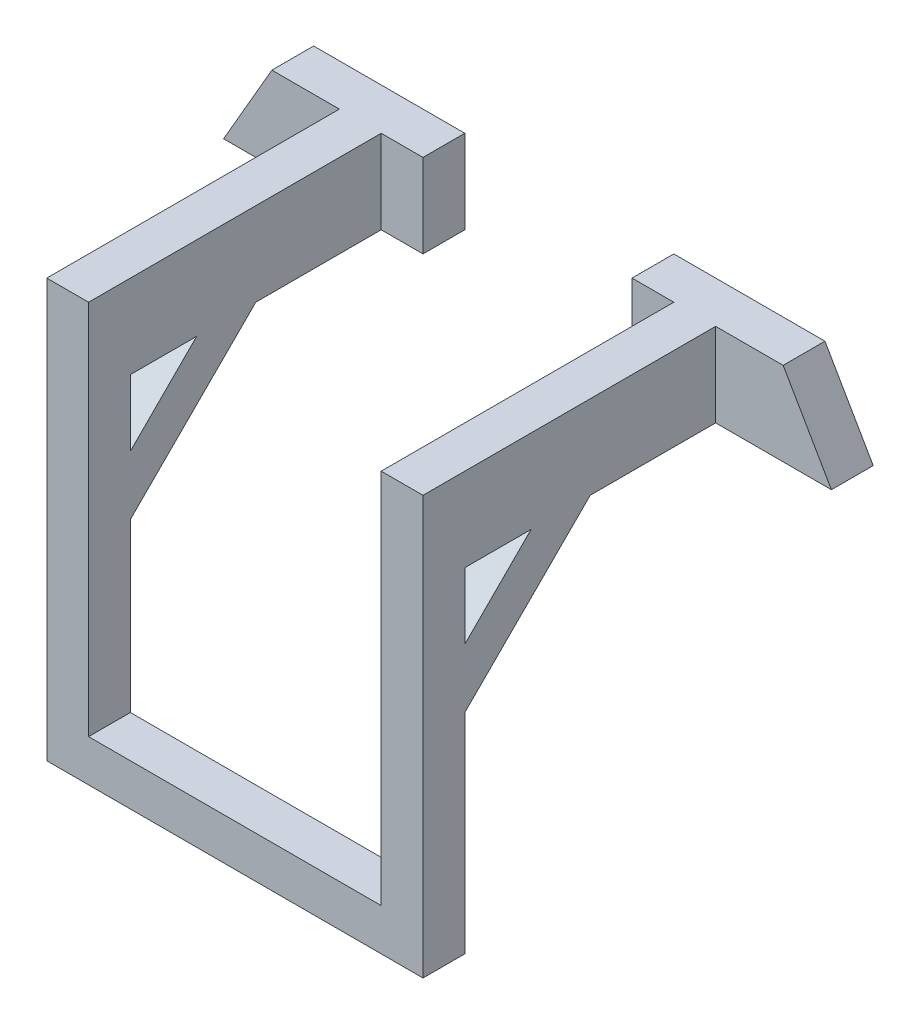
ISO-10303-21;
HEADER;
FILE_DESCRIPTION(('STEP AP214'),'2;1');
FILE_NAME('part.step','',(''),(''),'','','');
FILE_SCHEMA(('AUTOMOTIVE_DESIGN { 1 0 10303 214 1 1 1 1 }'));
ENDSEC;
DATA;
#1=APPLICATION_CONTEXT('core data for automotive mechanical design processes');
#2=APPLICATION_PROTOCOL_DEFINITION('international standard','automotive_design',2000,#1);
#3=PRODUCT_CONTEXT('',#1,'mechanical');
#4=PRODUCT('Part','Part','',(#3));
#5=PRODUCT_RELATED_PRODUCT_CATEGORY('part','',(#4));
#6=PRODUCT_DEFINITION_FORMATION('','',#4);
#7=PRODUCT_DEFINITION_CONTEXT('part definition',#1,'design');
#8=PRODUCT_DEFINITION('design','',#6,#7);
#9=PRODUCT_DEFINITION_SHAPE('','',#8);
#10=(LENGTH_UNIT() NAMED_UNIT(*) SI_UNIT(.MILLI.,.METRE.));
#11=(NAMED_UNIT(*) PLANE_ANGLE_UNIT() SI_UNIT($,.RADIAN.));
#12=(NAMED_UNIT(*) SI_UNIT($,.STERADIAN.) SOLID_ANGLE_UNIT());
#13=UNCERTAINTY_MEASURE_WITH_UNIT(LENGTH_MEASURE(1.E-05),#10,'distance_accuracy_value','');
#14=(GEOMETRIC_REPRESENTATION_CONTEXT(3) GLOBAL_UNCERTAINTY_ASSIGNED_CONTEXT((#13)) GLOBAL_UNIT_ASSIGNED_CONTEXT((#10,
#11,#12)) REPRESENTATION_CONTEXT('',''));
#15=CARTESIAN_POINT('',(0.,0.,0.));
#16=DIRECTION('',(0.,0.,1.));
#17=DIRECTION('',(1.,0.,0.));
#18=AXIS2_PLACEMENT_3D('',#15,#16,#17);
#19=CARTESIAN_POINT('',(225.,50.,0.));
#20=DIRECTION('',(0.,1.,0.));
#21=DIRECTION('',(1.,0.,0.));
#22=AXIS2_PLACEMENT_3D('',#19,#20,#21);
#23=PLANE('',#22);
#24=DIRECTION('',(0.,0.,1.));
#25=VECTOR('',#24,1.);
#26=CARTESIAN_POINT('',(175.,50.,0.));
#27=LINE('',#26,#25);
#28=CARTESIAN_POINT('',(175.,50.,0.));
#29=VERTEX_POINT('',#28);
#30=CARTESIAN_POINT('',(175.,50.,350.));
#31=VERTEX_POINT('',#30);
#32=EDGE_CURVE('E11',#29,#31,#27,.T.);
#33=ORIENTED_EDGE('',*,*,#32,.T.);
#34=DIRECTION('',(-1.,0.,0.));
#35=VECTOR('',#34,1.);
#36=CARTESIAN_POINT('',(175.,50.,350.));
#37=LINE('',#36,#35);
#38=CARTESIAN_POINT('',(225.,50.,350.));
#39=VERTEX_POINT('',#38);
#40=EDGE_CURVE('E460',#39,#31,#37,.T.);
#41=ORIENTED_EDGE('',*,*,#40,.F.);
#42=DIRECTION('',(0.,0.,1.));
#43=VECTOR('',#42,1.);
#44=CARTESIAN_POINT('',(225.,50.,0.));
#45=LINE('',#44,#43);
#46=CARTESIAN_POINT('',(225.,50.,0.));
#47=VERTEX_POINT('',#46);
#48=EDGE_CURVE('E434',#47,#39,#45,.T.);
#49=ORIENTED_EDGE('',*,*,#48,.F.);
#50=DIRECTION('',(1.,0.,0.));
#51=VECTOR('',#50,1.);
#52=CARTESIAN_POINT('',(175.,50.,0.));
#53=LINE('',#52,#51);
#54=CARTESIAN_POINT('',(305.764973081037,50.,0.));
#55=VERTEX_POINT('',#54);
#56=EDGE_CURVE('E490',#47,#55,#53,.T.);
#57=ORIENTED_EDGE('',*,*,#56,.T.);
#58=DIRECTION('',(0.,0.,-1.));
#59=VECTOR('',#58,1.);
#60=CARTESIAN_POINT('',(305.764973081037,50.,0.));
#61=LINE('',#60,#59);
#62=CARTESIAN_POINT('',(305.764973081037,50.,-50.));
#63=VERTEX_POINT('',#62);
#64=EDGE_CURVE('E431',#55,#63,#61,.T.);
#65=ORIENTED_EDGE('',*,*,#64,.T.);
#66=DIRECTION('',(1.,0.,0.));
#67=VECTOR('',#66,1.);
#68=CARTESIAN_POINT('',(125.,50.,-50.));
#69=LINE('',#68,#67);
#70=CARTESIAN_POINT('',(125.,50.,-50.));
#71=VERTEX_POINT('',#70);
#72=EDGE_CURVE('E531',#71,#63,#69,.T.);
#73=ORIENTED_EDGE('',*,*,#72,.F.);
#74=DIRECTION('',(0.,0.,-1.));
#75=VECTOR('',#74,1.);
#76=CARTESIAN_POINT('',(125.,50.,0.));
#77=LINE('',#76,#75);
#78=CARTESIAN_POINT('',(125.,50.,0.));
#79=VERTEX_POINT('',#78);
#80=EDGE_CURVE('E376',#79,#71,#77,.T.);
#81=ORIENTED_EDGE('',*,*,#80,.F.);
#82=DIRECTION('',(1.,0.,0.));
#83=VECTOR('',#82,1.);
#84=CARTESIAN_POINT('',(175.,50.,0.));
#85=LINE('',#84,#83);
#86=EDGE_CURVE('E400',#79,#29,#85,.T.);
#87=ORIENTED_EDGE('',*,*,#86,.T.);
#88=EDGE_LOOP('',(#33,#41,#49,#57,#65,#73,#81,#87));
#89=FACE_BOUND('',#88,.T.);
#90=ADVANCED_FACE('F17',(#89),#23,.T.);
#91=CARTESIAN_POINT('',(175.,50.,0.));
#92=DIRECTION('',(-1.,0.,0.));
#93=DIRECTION('',(0.,0.,1.));
#94=AXIS2_PLACEMENT_3D('',#91,#92,#93);
#95=PLANE('',#94);
#96=DIRECTION('',(0.,0.707106781186546,-0.707106781186549));
#97=VECTOR('',#96,1.);
#98=CARTESIAN_POINT('',(175.,-69.8223304703362,240.533008588991));
#99=LINE('',#98,#97);
#100=CARTESIAN_POINT('',(175.,-129.289321881345,300.));
#101=VERTEX_POINT('',#100);
#102=CARTESIAN_POINT('',(175.,-50.,220.710678118655));
#103=VERTEX_POINT('',#102);
#104=EDGE_CURVE('E415',#101,#103,#99,.T.);
#105=ORIENTED_EDGE('',*,*,#104,.T.);
#106=DIRECTION('',(0.,0.,1.));
#107=VECTOR('',#106,1.);
#108=CARTESIAN_POINT('',(175.,-50.,0.));
#109=LINE('',#108,#107);
#110=CARTESIAN_POINT('',(175.,-50.,300.));
#111=VERTEX_POINT('',#110);
#112=EDGE_CURVE('E418',#103,#111,#109,.T.);
#113=ORIENTED_EDGE('',*,*,#112,.T.);
#114=DIRECTION('',(0.,-1.,0.));
#115=VECTOR('',#114,1.);
#116=CARTESIAN_POINT('',(175.,-50.,300.));
#117=LINE('',#116,#115);
#118=EDGE_CURVE('E382',#111,#101,#117,.T.);
#119=ORIENTED_EDGE('',*,*,#118,.T.);
#120=EDGE_LOOP('',(#105,#113,#119));
#121=FACE_BOUND('',#120,.T.);
#122=DIRECTION('',(0.,-1.,0.));
#123=VECTOR('',#122,1.);
#124=CARTESIAN_POINT('',(175.,-50.,300.));
#125=LINE('',#124,#123);
#126=CARTESIAN_POINT('',(175.,-200.,300.));
#127=VERTEX_POINT('',#126);
#128=CARTESIAN_POINT('',(175.,-400.,300.));
#129=VERTEX_POINT('',#128);
#130=EDGE_CURVE('E21',#127,#129,#125,.T.);
#131=ORIENTED_EDGE('',*,*,#130,.T.);
#132=DIRECTION('',(0.,0.,1.));
#133=VECTOR('',#132,1.);
#134=CARTESIAN_POINT('',(175.,-400.,162.5));
#135=LINE('',#134,#133);
#136=CARTESIAN_POINT('',(175.,-400.,350.));
#137=VERTEX_POINT('',#136);
#138=EDGE_CURVE('E395',#129,#137,#135,.T.);
#139=ORIENTED_EDGE('',*,*,#138,.T.);
#140=DIRECTION('',(0.,-1.,0.));
#141=VECTOR('',#140,1.);
#142=CARTESIAN_POINT('',(175.,-50.,350.));
#143=LINE('',#142,#141);
#144=EDGE_CURVE('E435',#31,#137,#143,.T.);
#145=ORIENTED_EDGE('',*,*,#144,.F.);
#146=ORIENTED_EDGE('',*,*,#32,.F.);
#147=DIRECTION('',(0.,1.,0.));
#148=VECTOR('',#147,1.);
#149=CARTESIAN_POINT('',(175.,-50.,0.));
#150=LINE('',#149,#148);
#151=CARTESIAN_POINT('',(175.,-50.,0.));
#152=VERTEX_POINT('',#151);
#153=EDGE_CURVE('E297',#152,#29,#150,.T.);
#154=ORIENTED_EDGE('',*,*,#153,.F.);
#155=DIRECTION('',(0.,0.,1.));
#156=VECTOR('',#155,1.);
#157=CARTESIAN_POINT('',(175.,-50.,0.));
#158=LINE('',#157,#156);
#159=CARTESIAN_POINT('',(175.,-50.,150.));
#160=VERTEX_POINT('',#159);
#161=EDGE_CURVE('E396',#152,#160,#158,.T.);
#162=ORIENTED_EDGE('',*,*,#161,.T.);
#163=DIRECTION('',(0.,-0.707106781186547,0.707106781186548));
#164=VECTOR('',#163,1.);
#165=CARTESIAN_POINT('',(175.,-200.,300.));
#166=LINE('',#165,#164);
#167=EDGE_CURVE('E346',#160,#127,#166,.T.);
#168=ORIENTED_EDGE('',*,*,#167,.T.);
#169=EDGE_LOOP('',(#131,#139,#145,#146,#154,#162,#168));
#170=FACE_BOUND('',#169,.T.);
#171=ADVANCED_FACE('F591',(#121,#170),#95,.T.);
#172=CARTESIAN_POINT('',(200.,-450.,325.));
#173=DIRECTION('',(0.,-1.,0.));
#174=DIRECTION('',(0.,0.,-1.));
#175=AXIS2_PLACEMENT_3D('',#172,#173,#174);
#176=PLANE('',#175);
#177=DIRECTION('',(-1.,0.,0.));
#178=VECTOR('',#177,1.);
#179=CARTESIAN_POINT('',(225.,-450.,350.));
#180=LINE('',#179,#178);
#181=CARTESIAN_POINT('',(225.,-450.,350.));
#182=VERTEX_POINT('',#181);
#183=CARTESIAN_POINT('',(-225.,-450.,350.));
#184=VERTEX_POINT('',#183);
#185=EDGE_CURVE('E432',#182,#184,#180,.T.);
#186=ORIENTED_EDGE('',*,*,#185,.T.);
#187=DIRECTION('',(0.,0.,-1.));
#188=VECTOR('',#187,1.);
#189=CARTESIAN_POINT('',(-225.,-450.,350.));
#190=LINE('',#189,#188);
#191=CARTESIAN_POINT('',(-225.,-450.,300.));
#192=VERTEX_POINT('',#191);
#193=EDGE_CURVE('E367',#184,#192,#190,.T.);
#194=ORIENTED_EDGE('',*,*,#193,.T.);
#195=DIRECTION('',(1.,0.,0.));
#196=VECTOR('',#195,1.);
#197=CARTESIAN_POINT('',(-225.,-450.,300.));
#198=LINE('',#197,#196);
#199=CARTESIAN_POINT('',(225.,-450.,300.));
#200=VERTEX_POINT('',#199);
#201=EDGE_CURVE('E361',#192,#200,#198,.T.);
#202=ORIENTED_EDGE('',*,*,#201,.T.);
#203=DIRECTION('',(0.,0.,1.));
#204=VECTOR('',#203,1.);
#205=CARTESIAN_POINT('',(225.,-450.,0.));
#206=LINE('',#205,#204);
#207=EDGE_CURVE('E28',#200,#182,#206,.T.);
#208=ORIENTED_EDGE('',*,*,#207,.T.);
#209=EDGE_LOOP('',(#186,#194,#202,#208));
#210=FACE_BOUND('',#209,.T.);
#211=ADVANCED_FACE('F602',(#210),#176,.T.);
#212=CARTESIAN_POINT('',(225.,-50.,0.));
#213=DIRECTION('',(1.,0.,0.));
#214=DIRECTION('',(0.,1.,0.));
#215=AXIS2_PLACEMENT_3D('',#212,#213,#214);
#216=PLANE('',#215);
#217=DIRECTION('',(0.,-1.,0.));
#218=VECTOR('',#217,1.);
#219=CARTESIAN_POINT('',(225.,-49.9999999999994,300.));
#220=LINE('',#219,#218);
#221=CARTESIAN_POINT('',(225.,-49.9999999999994,300.));
#222=VERTEX_POINT('',#221);
#223=CARTESIAN_POINT('',(225.,-129.289321881345,300.));
#224=VERTEX_POINT('',#223);
#225=EDGE_CURVE('E476',#222,#224,#220,.T.);
#226=ORIENTED_EDGE('',*,*,#225,.F.);
#227=DIRECTION('',(0.,0.,1.));
#228=VECTOR('',#227,1.);
#229=CARTESIAN_POINT('',(225.,-50.,0.));
#230=LINE('',#229,#228);
#231=CARTESIAN_POINT('',(225.,-50.,220.710678118655));
#232=VERTEX_POINT('',#231);
#233=EDGE_CURVE('E473',#232,#222,#230,.T.);
#234=ORIENTED_EDGE('',*,*,#233,.F.);
#235=DIRECTION('',(0.,-0.707106781186546,0.707106781186549));
#236=VECTOR('',#235,1.);
#237=CARTESIAN_POINT('',(225.,-69.8223304703362,240.533008588991));
#238=LINE('',#237,#236);
#239=EDGE_CURVE('E401',#232,#224,#238,.T.);
#240=ORIENTED_EDGE('',*,*,#239,.T.);
#241=EDGE_LOOP('',(#226,#234,#240));
#242=FACE_BOUND('',#241,.T.);
#243=DIRECTION('',(0.,0.707106781186547,-0.707106781186548));
#244=VECTOR('',#243,1.);
#245=CARTESIAN_POINT('',(225.,-200.,300.));
#246=LINE('',#245,#244);
#247=CARTESIAN_POINT('',(225.,-200.,300.));
#248=VERTEX_POINT('',#247);
#249=CARTESIAN_POINT('',(225.,-50.,150.));
#250=VERTEX_POINT('',#249);
#251=EDGE_CURVE('E342',#248,#250,#246,.T.);
#252=ORIENTED_EDGE('',*,*,#251,.T.);
#253=DIRECTION('',(0.,0.,1.));
#254=VECTOR('',#253,1.);
#255=CARTESIAN_POINT('',(225.,-50.,0.));
#256=LINE('',#255,#254);
#257=CARTESIAN_POINT('',(225.,-50.,0.));
#258=VERTEX_POINT('',#257);
#259=EDGE_CURVE('E392',#258,#250,#256,.T.);
#260=ORIENTED_EDGE('',*,*,#259,.F.);
#261=DIRECTION('',(0.,-1.,0.));
#262=VECTOR('',#261,1.);
#263=CARTESIAN_POINT('',(225.,50.,0.));
#264=LINE('',#263,#262);
#265=EDGE_CURVE('E503',#47,#258,#264,.T.);
#266=ORIENTED_EDGE('',*,*,#265,.F.);
#267=ORIENTED_EDGE('',*,*,#48,.T.);
#268=DIRECTION('',(0.,-1.,0.));
#269=VECTOR('',#268,1.);
#270=CARTESIAN_POINT('',(225.,-49.9999999999994,350.));
#271=LINE('',#270,#269);
#272=EDGE_CURVE('E520',#39,#182,#271,.T.);
#273=ORIENTED_EDGE('',*,*,#272,.T.);
#274=ORIENTED_EDGE('',*,*,#207,.F.);
#275=DIRECTION('',(0.,-1.,0.));
#276=VECTOR('',#275,1.);
#277=CARTESIAN_POINT('',(225.,-49.9999999999994,300.));
#278=LINE('',#277,#276);
#279=EDGE_CURVE('E366',#248,#200,#278,.T.);
#280=ORIENTED_EDGE('',*,*,#279,.F.);
#281=EDGE_LOOP('',(#252,#260,#266,#267,#273,#274,#280));
#282=FACE_BOUND('',#281,.T.);
#283=ADVANCED_FACE('F598',(#242,#282),#216,.T.);
#284=CARTESIAN_POINT('',(200.,0.,350.));
#285=DIRECTION('',(0.,0.,1.));
#286=DIRECTION('',(1.,0.,0.));
#287=AXIS2_PLACEMENT_3D('',#284,#285,#286);
#288=PLANE('',#287);
#289=ORIENTED_EDGE('',*,*,#272,.F.);
#290=ORIENTED_EDGE('',*,*,#40,.T.);
#291=ORIENTED_EDGE('',*,*,#144,.T.);
#292=DIRECTION('',(1.,0.,0.));
#293=VECTOR('',#292,1.);
#294=CARTESIAN_POINT('',(225.,-400.,350.));
#295=LINE('',#294,#293);
#296=CARTESIAN_POINT('',(-175.,-400.,350.));
#297=VERTEX_POINT('',#296);
#298=EDGE_CURVE('E371',#297,#137,#295,.T.);
#299=ORIENTED_EDGE('',*,*,#298,.F.);
#300=DIRECTION('',(0.,-1.,0.));
#301=VECTOR('',#300,1.);
#302=CARTESIAN_POINT('',(-175.,-50.,350.));
#303=LINE('',#302,#301);
#304=CARTESIAN_POINT('',(-175.,50.,350.));
#305=VERTEX_POINT('',#304);
#306=EDGE_CURVE('E547',#305,#297,#303,.T.);
#307=ORIENTED_EDGE('',*,*,#306,.F.);
#308=DIRECTION('',(-1.,0.,0.));
#309=VECTOR('',#308,1.);
#310=CARTESIAN_POINT('',(-225.,50.,350.));
#311=LINE('',#310,#309);
#312=CARTESIAN_POINT('',(-225.,50.,350.));
#313=VERTEX_POINT('',#312);
#314=EDGE_CURVE('E524',#305,#313,#311,.T.);
#315=ORIENTED_EDGE('',*,*,#314,.T.);
#316=DIRECTION('',(0.,-1.,0.));
#317=VECTOR('',#316,1.);
#318=CARTESIAN_POINT('',(-225.,-50.,350.));
#319=LINE('',#318,#317);
#320=EDGE_CURVE('E370',#313,#184,#319,.T.);
#321=ORIENTED_EDGE('',*,*,#320,.T.);
#322=ORIENTED_EDGE('',*,*,#185,.F.);
#323=EDGE_LOOP('',(#289,#290,#291,#299,#307,#315,#321,#322));
#324=FACE_BOUND('',#323,.T.);
#325=ADVANCED_FACE('F601',(#324),#288,.T.);
#326=CARTESIAN_POINT('',(-175.,50.,0.));
#327=DIRECTION('',(0.,1.,0.));
#328=DIRECTION('',(1.,0.,0.));
#329=AXIS2_PLACEMENT_3D('',#326,#327,#328);
#330=PLANE('',#329);
#331=DIRECTION('',(0.,0.,1.));
#332=VECTOR('',#331,1.);
#333=CARTESIAN_POINT('',(-225.,50.,0.));
#334=LINE('',#333,#332);
#335=CARTESIAN_POINT('',(-225.,50.,0.));
#336=VERTEX_POINT('',#335);
#337=EDGE_CURVE('E548',#336,#313,#334,.T.);
#338=ORIENTED_EDGE('',*,*,#337,.T.);
#339=ORIENTED_EDGE('',*,*,#314,.F.);
#340=DIRECTION('',(0.,0.,1.));
#341=VECTOR('',#340,1.);
#342=CARTESIAN_POINT('',(-175.,50.,0.));
#343=LINE('',#342,#341);
#344=CARTESIAN_POINT('',(-175.,50.,0.));
#345=VERTEX_POINT('',#344);
#346=EDGE_CURVE('E291',#345,#305,#343,.T.);
#347=ORIENTED_EDGE('',*,*,#346,.F.);
#348=DIRECTION('',(1.,0.,0.));
#349=VECTOR('',#348,1.);
#350=CARTESIAN_POINT('',(-305.764973081037,50.,0.));
#351=LINE('',#350,#349);
#352=CARTESIAN_POINT('',(-125.,50.,0.));
#353=VERTEX_POINT('',#352);
#354=EDGE_CURVE('E283',#345,#353,#351,.T.);
#355=ORIENTED_EDGE('',*,*,#354,.T.);
#356=DIRECTION('',(0.,0.,-1.));
#357=VECTOR('',#356,1.);
#358=CARTESIAN_POINT('',(-125.,50.,0.));
#359=LINE('',#358,#357);
#360=CARTESIAN_POINT('',(-125.,50.,-50.));
#361=VERTEX_POINT('',#360);
#362=EDGE_CURVE('E287',#353,#361,#359,.T.);
#363=ORIENTED_EDGE('',*,*,#362,.T.);
#364=DIRECTION('',(1.,0.,0.));
#365=VECTOR('',#364,1.);
#366=CARTESIAN_POINT('',(-305.764973081037,50.,-50.));
#367=LINE('',#366,#365);
#368=CARTESIAN_POINT('',(-305.764973081037,50.,-50.));
#369=VERTEX_POINT('',#368);
#370=EDGE_CURVE('E308',#369,#361,#367,.T.);
#371=ORIENTED_EDGE('',*,*,#370,.F.);
#372=DIRECTION('',(0.,0.,-1.));
#373=VECTOR('',#372,1.);
#374=CARTESIAN_POINT('',(-305.764973081037,50.,0.));
#375=LINE('',#374,#373);
#376=CARTESIAN_POINT('',(-305.764973081037,50.,0.));
#377=VERTEX_POINT('',#376);
#378=EDGE_CURVE('E426',#377,#369,#375,.T.);
#379=ORIENTED_EDGE('',*,*,#378,.F.);
#380=DIRECTION('',(1.,0.,0.));
#381=VECTOR('',#380,1.);
#382=CARTESIAN_POINT('',(-305.764973081037,50.,0.));
#383=LINE('',#382,#381);
#384=EDGE_CURVE('E381',#377,#336,#383,.T.);
#385=ORIENTED_EDGE('',*,*,#384,.T.);
#386=EDGE_LOOP('',(#338,#339,#347,#355,#363,#371,#379,#385));
#387=FACE_BOUND('',#386,.T.);
#388=ADVANCED_FACE('F286',(#387),#330,.T.);
#389=CARTESIAN_POINT('',(-175.,-50.,0.));
#390=DIRECTION('',(1.,0.,0.));
#391=DIRECTION('',(0.,1.,0.));
#392=AXIS2_PLACEMENT_3D('',#389,#390,#391);
#393=PLANE('',#392);
#394=DIRECTION('',(0.,-1.,0.));
#395=VECTOR('',#394,1.);
#396=CARTESIAN_POINT('',(-175.,-50.,300.));
#397=LINE('',#396,#395);
#398=CARTESIAN_POINT('',(-175.,-50.,300.));
#399=VERTEX_POINT('',#398);
#400=CARTESIAN_POINT('',(-175.,-129.289321881345,300.));
#401=VERTEX_POINT('',#400);
#402=EDGE_CURVE('E341',#399,#401,#397,.T.);
#403=ORIENTED_EDGE('',*,*,#402,.F.);
#404=DIRECTION('',(0.,0.,1.));
#405=VECTOR('',#404,1.);
#406=CARTESIAN_POINT('',(-175.,-50.,0.));
#407=LINE('',#406,#405);
#408=CARTESIAN_POINT('',(-175.,-50.,220.710678118655));
#409=VERTEX_POINT('',#408);
#410=EDGE_CURVE('E411',#409,#399,#407,.T.);
#411=ORIENTED_EDGE('',*,*,#410,.F.);
#412=DIRECTION('',(0.,0.707106781186546,-0.707106781186549));
#413=VECTOR('',#412,1.);
#414=CARTESIAN_POINT('',(-175.,-69.8223304703362,240.533008588991));
#415=LINE('',#414,#413);
#416=EDGE_CURVE('E334',#401,#409,#415,.T.);
#417=ORIENTED_EDGE('',*,*,#416,.F.);
#418=EDGE_LOOP('',(#403,#411,#417));
#419=FACE_BOUND('',#418,.T.);
#420=DIRECTION('',(0.,-0.707106781186547,0.707106781186548));
#421=VECTOR('',#420,1.);
#422=CARTESIAN_POINT('',(-175.,-200.,300.));
#423=LINE('',#422,#421);
#424=CARTESIAN_POINT('',(-175.,-50.,150.));
#425=VERTEX_POINT('',#424);
#426=CARTESIAN_POINT('',(-175.,-200.,300.));
#427=VERTEX_POINT('',#426);
#428=EDGE_CURVE('E557',#425,#427,#423,.T.);
#429=ORIENTED_EDGE('',*,*,#428,.F.);
#430=DIRECTION('',(0.,0.,1.));
#431=VECTOR('',#430,1.);
#432=CARTESIAN_POINT('',(-175.,-50.,0.));
#433=LINE('',#432,#431);
#434=CARTESIAN_POINT('',(-175.,-50.,0.));
#435=VERTEX_POINT('',#434);
#436=EDGE_CURVE('E406',#435,#425,#433,.T.);
#437=ORIENTED_EDGE('',*,*,#436,.F.);
#438=DIRECTION('',(0.,-1.,0.));
#439=VECTOR('',#438,1.);
#440=CARTESIAN_POINT('',(-175.,50.,0.));
#441=LINE('',#440,#439);
#442=EDGE_CURVE('E483',#345,#435,#441,.T.);
#443=ORIENTED_EDGE('',*,*,#442,.F.);
#444=ORIENTED_EDGE('',*,*,#346,.T.);
#445=ORIENTED_EDGE('',*,*,#306,.T.);
#446=DIRECTION('',(0.,0.,-1.));
#447=VECTOR('',#446,1.);
#448=CARTESIAN_POINT('',(-175.,-400.,162.5));
#449=LINE('',#448,#447);
#450=CARTESIAN_POINT('',(-175.,-400.,300.));
#451=VERTEX_POINT('',#450);
#452=EDGE_CURVE('E422',#297,#451,#449,.T.);
#453=ORIENTED_EDGE('',*,*,#452,.T.);
#454=DIRECTION('',(0.,-1.,0.));
#455=VECTOR('',#454,1.);
#456=CARTESIAN_POINT('',(-175.,-50.,300.));
#457=LINE('',#456,#455);
#458=EDGE_CURVE('E336',#427,#451,#457,.T.);
#459=ORIENTED_EDGE('',*,*,#458,.F.);
#460=EDGE_LOOP('',(#429,#437,#443,#444,#445,#453,#459));
#461=FACE_BOUND('',#460,.T.);
#462=ADVANCED_FACE('F743',(#419,#461),#393,.T.);
#463=CARTESIAN_POINT('',(-225.,50.,0.));
#464=DIRECTION('',(-1.,0.,0.));
#465=DIRECTION('',(0.,0.,1.));
#466=AXIS2_PLACEMENT_3D('',#463,#464,#465);
#467=PLANE('',#466);
#468=DIRECTION('',(0.,-0.707106781186546,0.707106781186549));
#469=VECTOR('',#468,1.);
#470=CARTESIAN_POINT('',(-225.,-69.8223304703362,240.533008588991));
#471=LINE('',#470,#469);
#472=CARTESIAN_POINT('',(-225.,-50.,220.710678118655));
#473=VERTEX_POINT('',#472);
#474=CARTESIAN_POINT('',(-225.,-129.289321881345,300.));
#475=VERTEX_POINT('',#474);
#476=EDGE_CURVE('E335',#473,#475,#471,.T.);
#477=ORIENTED_EDGE('',*,*,#476,.F.);
#478=DIRECTION('',(0.,0.,1.));
#479=VECTOR('',#478,1.);
#480=CARTESIAN_POINT('',(-225.,-50.,0.));
#481=LINE('',#480,#479);
#482=CARTESIAN_POINT('',(-225.,-50.,300.));
#483=VERTEX_POINT('',#482);
#484=EDGE_CURVE('E407',#473,#483,#481,.T.);
#485=ORIENTED_EDGE('',*,*,#484,.T.);
#486=DIRECTION('',(0.,-1.,0.));
#487=VECTOR('',#486,1.);
#488=CARTESIAN_POINT('',(-225.,-50.,300.));
#489=LINE('',#488,#487);
#490=EDGE_CURVE('E525',#483,#475,#489,.T.);
#491=ORIENTED_EDGE('',*,*,#490,.T.);
#492=EDGE_LOOP('',(#477,#485,#491));
#493=FACE_BOUND('',#492,.T.);
#494=DIRECTION('',(0.,-1.,0.));
#495=VECTOR('',#494,1.);
#496=CARTESIAN_POINT('',(-225.,-50.,300.));
#497=LINE('',#496,#495);
#498=CARTESIAN_POINT('',(-225.,-200.,300.));
#499=VERTEX_POINT('',#498);
#500=EDGE_CURVE('E365',#499,#192,#497,.T.);
#501=ORIENTED_EDGE('',*,*,#500,.T.);
#502=ORIENTED_EDGE('',*,*,#193,.F.);
#503=ORIENTED_EDGE('',*,*,#320,.F.);
#504=ORIENTED_EDGE('',*,*,#337,.F.);
#505=DIRECTION('',(0.,1.,0.));
#506=VECTOR('',#505,1.);
#507=CARTESIAN_POINT('',(-225.,-50.,0.));
#508=LINE('',#507,#506);
#509=CARTESIAN_POINT('',(-225.,-50.,0.));
#510=VERTEX_POINT('',#509);
#511=EDGE_CURVE('E351',#510,#336,#508,.T.);
#512=ORIENTED_EDGE('',*,*,#511,.F.);
#513=DIRECTION('',(0.,0.,1.));
#514=VECTOR('',#513,1.);
#515=CARTESIAN_POINT('',(-225.,-50.,0.));
#516=LINE('',#515,#514);
#517=CARTESIAN_POINT('',(-225.,-50.,150.));
#518=VERTEX_POINT('',#517);
#519=EDGE_CURVE('E410',#510,#518,#516,.T.);
#520=ORIENTED_EDGE('',*,*,#519,.T.);
#521=DIRECTION('',(0.,0.707106781186547,-0.707106781186548));
#522=VECTOR('',#521,1.);
#523=CARTESIAN_POINT('',(-225.,-200.,300.));
#524=LINE('',#523,#522);
#525=EDGE_CURVE('E462',#499,#518,#524,.T.);
#526=ORIENTED_EDGE('',*,*,#525,.F.);
#527=EDGE_LOOP('',(#501,#502,#503,#504,#512,#520,#526));
#528=FACE_BOUND('',#527,.T.);
#529=ADVANCED_FACE('F707',(#493,#528),#467,.T.);
#530=CARTESIAN_POINT('',(4.9737991503207E-13,-400.,325.));
#531=DIRECTION('',(0.,1.,0.));
#532=DIRECTION('',(1.,0.,0.));
#533=AXIS2_PLACEMENT_3D('',#530,#531,#532);
#534=PLANE('',#533);
#535=ORIENTED_EDGE('',*,*,#138,.F.);
#536=DIRECTION('',(-1.,0.,0.));
#537=VECTOR('',#536,1.);
#538=CARTESIAN_POINT('',(-225.,-400.,300.));
#539=LINE('',#538,#537);
#540=EDGE_CURVE('E340',#129,#451,#539,.T.);
#541=ORIENTED_EDGE('',*,*,#540,.T.);
#542=ORIENTED_EDGE('',*,*,#452,.F.);
#543=ORIENTED_EDGE('',*,*,#298,.T.);
#544=EDGE_LOOP('',(#535,#541,#542,#543));
#545=FACE_BOUND('',#544,.T.);
#546=ADVANCED_FACE('F739',(#545),#534,.T.);
#547=CARTESIAN_POINT('',(175.,-50.,0.));
#548=DIRECTION('',(0.,-1.,0.));
#549=DIRECTION('',(-1.,0.,0.));
#550=AXIS2_PLACEMENT_3D('',#547,#548,#549);
#551=PLANE('',#550);
#552=DIRECTION('',(-1.,0.,0.));
#553=VECTOR('',#552,1.);
#554=CARTESIAN_POINT('',(200.,-50.,150.));
#555=LINE('',#554,#553);
#556=EDGE_CURVE('E386',#250,#160,#555,.T.);
#557=ORIENTED_EDGE('',*,*,#556,.T.);
#558=ORIENTED_EDGE('',*,*,#161,.F.);
#559=DIRECTION('',(-1.,0.,0.));
#560=VECTOR('',#559,1.);
#561=CARTESIAN_POINT('',(363.5,-50.,0.));
#562=LINE('',#561,#560);
#563=CARTESIAN_POINT('',(125.,-50.,0.));
#564=VERTEX_POINT('',#563);
#565=EDGE_CURVE('E372',#152,#564,#562,.T.);
#566=ORIENTED_EDGE('',*,*,#565,.T.);
#567=DIRECTION('',(0.,0.,-1.));
#568=VECTOR('',#567,1.);
#569=CARTESIAN_POINT('',(125.,-50.,0.));
#570=LINE('',#569,#568);
#571=CARTESIAN_POINT('',(125.,-50.,-50.));
#572=VERTEX_POINT('',#571);
#573=EDGE_CURVE('E358',#564,#572,#570,.T.);
#574=ORIENTED_EDGE('',*,*,#573,.T.);
#575=DIRECTION('',(-1.,0.,0.));
#576=VECTOR('',#575,1.);
#577=CARTESIAN_POINT('',(363.5,-50.,-50.));
#578=LINE('',#577,#576);
#579=CARTESIAN_POINT('',(363.5,-50.,-50.));
#580=VERTEX_POINT('',#579);
#581=EDGE_CURVE('E511',#580,#572,#578,.T.);
#582=ORIENTED_EDGE('',*,*,#581,.F.);
#583=DIRECTION('',(0.,0.,-1.));
#584=VECTOR('',#583,1.);
#585=CARTESIAN_POINT('',(363.5,-50.,0.));
#586=LINE('',#585,#584);
#587=CARTESIAN_POINT('',(363.5,-50.,0.));
#588=VERTEX_POINT('',#587);
#589=EDGE_CURVE('E357',#588,#580,#586,.T.);
#590=ORIENTED_EDGE('',*,*,#589,.F.);
#591=DIRECTION('',(-1.,0.,0.));
#592=VECTOR('',#591,1.);
#593=CARTESIAN_POINT('',(363.5,-50.,0.));
#594=LINE('',#593,#592);
#595=EDGE_CURVE('E492',#588,#258,#594,.T.);
#596=ORIENTED_EDGE('',*,*,#595,.T.);
#597=ORIENTED_EDGE('',*,*,#259,.T.);
#598=EDGE_LOOP('',(#557,#558,#566,#574,#582,#590,#596,#597));
#599=FACE_BOUND('',#598,.T.);
#600=ADVANCED_FACE('F613',(#599),#551,.T.);
#601=CARTESIAN_POINT('',(175.,-50.,0.));
#602=DIRECTION('',(0.,-1.,0.));
#603=DIRECTION('',(-1.,0.,0.));
#604=AXIS2_PLACEMENT_3D('',#601,#602,#603);
#605=PLANE('',#604);
#606=DIRECTION('',(1.,0.,0.));
#607=VECTOR('',#606,1.);
#608=CARTESIAN_POINT('',(200.,-50.,220.710678118655));
#609=LINE('',#608,#607);
#610=EDGE_CURVE('E405',#103,#232,#609,.T.);
#611=ORIENTED_EDGE('',*,*,#610,.T.);
#612=ORIENTED_EDGE('',*,*,#233,.T.);
#613=DIRECTION('',(-1.,0.,0.));
#614=VECTOR('',#613,1.);
#615=CARTESIAN_POINT('',(175.,-50.,300.));
#616=LINE('',#615,#614);
#617=EDGE_CURVE('E385',#222,#111,#616,.T.);
#618=ORIENTED_EDGE('',*,*,#617,.T.);
#619=ORIENTED_EDGE('',*,*,#112,.F.);
#620=EDGE_LOOP('',(#611,#612,#618,#619));
#621=FACE_BOUND('',#620,.T.);
#622=ADVANCED_FACE('F583',(#621),#605,.T.);
#623=CARTESIAN_POINT('',(175.,-50.,300.));
#624=DIRECTION('',(0.,0.,-1.));
#625=DIRECTION('',(0.,-1.,0.));
#626=AXIS2_PLACEMENT_3D('',#623,#624,#625);
#627=PLANE('',#626);
#628=DIRECTION('',(-1.,0.,0.));
#629=VECTOR('',#628,1.);
#630=CARTESIAN_POINT('',(200.,-129.289321881345,300.));
#631=LINE('',#630,#629);
#632=EDGE_CURVE('E347',#224,#101,#631,.T.);
#633=ORIENTED_EDGE('',*,*,#632,.T.);
#634=ORIENTED_EDGE('',*,*,#118,.F.);
#635=ORIENTED_EDGE('',*,*,#617,.F.);
#636=ORIENTED_EDGE('',*,*,#225,.T.);
#637=EDGE_LOOP('',(#633,#634,#635,#636));
#638=FACE_BOUND('',#637,.T.);
#639=ADVANCED_FACE('F587',(#638),#627,.T.);
#640=CARTESIAN_POINT('',(225.,-50.,150.));
#641=DIRECTION('',(0.,-0.707106781186548,-0.707106781186547));
#642=DIRECTION('',(0.,0.707106781186547,-0.707106781186548));
#643=AXIS2_PLACEMENT_3D('',#640,#641,#642);
#644=PLANE('',#643);
#645=ORIENTED_EDGE('',*,*,#251,.F.);
#646=DIRECTION('',(1.,0.,0.));
#647=VECTOR('',#646,1.);
#648=CARTESIAN_POINT('',(200.,-200.,300.));
#649=LINE('',#648,#647);
#650=EDGE_CURVE('E575',#127,#248,#649,.T.);
#651=ORIENTED_EDGE('',*,*,#650,.F.);
#652=ORIENTED_EDGE('',*,*,#167,.F.);
#653=ORIENTED_EDGE('',*,*,#556,.F.);
#654=EDGE_LOOP('',(#645,#651,#652,#653));
#655=FACE_BOUND('',#654,.T.);
#656=ADVANCED_FACE('F610',(#655),#644,.T.);
#657=CARTESIAN_POINT('',(225.,-50.,220.710678118655));
#658=DIRECTION('',(0.,-0.707106781186549,-0.707106781186546));
#659=DIRECTION('',(0.,0.707106781186546,-0.707106781186549));
#660=AXIS2_PLACEMENT_3D('',#657,#658,#659);
#661=PLANE('',#660);
#662=ORIENTED_EDGE('',*,*,#239,.F.);
#663=ORIENTED_EDGE('',*,*,#610,.F.);
#664=ORIENTED_EDGE('',*,*,#104,.F.);
#665=ORIENTED_EDGE('',*,*,#632,.F.);
#666=EDGE_LOOP('',(#662,#663,#664,#665));
#667=FACE_BOUND('',#666,.T.);
#668=ADVANCED_FACE('F596',(#667),#661,.F.);
#669=CARTESIAN_POINT('',(-225.,-50.,0.));
#670=DIRECTION('',(0.,-1.,0.));
#671=DIRECTION('',(0.,0.,-1.));
#672=AXIS2_PLACEMENT_3D('',#669,#670,#671);
#673=PLANE('',#672);
#674=DIRECTION('',(-1.,0.,0.));
#675=VECTOR('',#674,1.);
#676=CARTESIAN_POINT('',(-225.,-50.,150.));
#677=LINE('',#676,#675);
#678=EDGE_CURVE('E466',#425,#518,#677,.T.);
#679=ORIENTED_EDGE('',*,*,#678,.T.);
#680=ORIENTED_EDGE('',*,*,#519,.F.);
#681=DIRECTION('',(-1.,0.,0.));
#682=VECTOR('',#681,1.);
#683=CARTESIAN_POINT('',(-125.,-50.,0.));
#684=LINE('',#683,#682);
#685=CARTESIAN_POINT('',(-363.5,-50.,0.));
#686=VERTEX_POINT('',#685);
#687=EDGE_CURVE('E436',#510,#686,#684,.T.);
#688=ORIENTED_EDGE('',*,*,#687,.T.);
#689=DIRECTION('',(0.,0.,-1.));
#690=VECTOR('',#689,1.);
#691=CARTESIAN_POINT('',(-363.5,-50.,0.));
#692=LINE('',#691,#690);
#693=CARTESIAN_POINT('',(-363.5,-50.,-50.));
#694=VERTEX_POINT('',#693);
#695=EDGE_CURVE('E315',#686,#694,#692,.T.);
#696=ORIENTED_EDGE('',*,*,#695,.T.);
#697=DIRECTION('',(-1.,0.,0.));
#698=VECTOR('',#697,1.);
#699=CARTESIAN_POINT('',(-125.,-50.,-50.));
#700=LINE('',#699,#698);
#701=CARTESIAN_POINT('',(-125.,-50.,-50.));
#702=VERTEX_POINT('',#701);
#703=EDGE_CURVE('E543',#702,#694,#700,.T.);
#704=ORIENTED_EDGE('',*,*,#703,.F.);
#705=DIRECTION('',(0.,0.,-1.));
#706=VECTOR('',#705,1.);
#707=CARTESIAN_POINT('',(-125.,-50.,0.));
#708=LINE('',#707,#706);
#709=CARTESIAN_POINT('',(-125.,-50.,0.));
#710=VERTEX_POINT('',#709);
#711=EDGE_CURVE('E314',#710,#702,#708,.T.);
#712=ORIENTED_EDGE('',*,*,#711,.F.);
#713=DIRECTION('',(-1.,0.,0.));
#714=VECTOR('',#713,1.);
#715=CARTESIAN_POINT('',(-125.,-50.,0.));
#716=LINE('',#715,#714);
#717=EDGE_CURVE('E298',#710,#435,#716,.T.);
#718=ORIENTED_EDGE('',*,*,#717,.T.);
#719=ORIENTED_EDGE('',*,*,#436,.T.);
#720=EDGE_LOOP('',(#679,#680,#688,#696,#704,#712,#718,#719));
#721=FACE_BOUND('',#720,.T.);
#722=ADVANCED_FACE('F717',(#721),#673,.T.);
#723=CARTESIAN_POINT('',(-225.,-50.,0.));
#724=DIRECTION('',(0.,-1.,0.));
#725=DIRECTION('',(0.,0.,-1.));
#726=AXIS2_PLACEMENT_3D('',#723,#724,#725);
#727=PLANE('',#726);
#728=DIRECTION('',(1.,0.,0.));
#729=VECTOR('',#728,1.);
#730=CARTESIAN_POINT('',(-225.,-50.,220.710678118655));
#731=LINE('',#730,#729);
#732=EDGE_CURVE('E467',#473,#409,#731,.T.);
#733=ORIENTED_EDGE('',*,*,#732,.T.);
#734=ORIENTED_EDGE('',*,*,#410,.T.);
#735=DIRECTION('',(-1.,0.,0.));
#736=VECTOR('',#735,1.);
#737=CARTESIAN_POINT('',(-225.,-50.,300.));
#738=LINE('',#737,#736);
#739=EDGE_CURVE('E328',#399,#483,#738,.T.);
#740=ORIENTED_EDGE('',*,*,#739,.T.);
#741=ORIENTED_EDGE('',*,*,#484,.F.);
#742=EDGE_LOOP('',(#733,#734,#740,#741));
#743=FACE_BOUND('',#742,.T.);
#744=ADVANCED_FACE('F730',(#743),#727,.T.);
#745=CARTESIAN_POINT('',(175.,-50.,300.));
#746=DIRECTION('',(0.,0.,-1.));
#747=DIRECTION('',(0.,-1.,0.));
#748=AXIS2_PLACEMENT_3D('',#745,#746,#747);
#749=PLANE('',#748);
#750=DIRECTION('',(1.,0.,0.));
#751=VECTOR('',#750,1.);
#752=CARTESIAN_POINT('',(-25.,-200.,300.));
#753=LINE('',#752,#751);
#754=EDGE_CURVE('E527',#499,#427,#753,.T.);
#755=ORIENTED_EDGE('',*,*,#754,.T.);
#756=ORIENTED_EDGE('',*,*,#458,.T.);
#757=ORIENTED_EDGE('',*,*,#540,.F.);
#758=ORIENTED_EDGE('',*,*,#130,.F.);
#759=ORIENTED_EDGE('',*,*,#650,.T.);
#760=ORIENTED_EDGE('',*,*,#279,.T.);
#761=ORIENTED_EDGE('',*,*,#201,.F.);
#762=ORIENTED_EDGE('',*,*,#500,.F.);
#763=EDGE_LOOP('',(#755,#756,#757,#758,#759,#760,#761,#762));
#764=FACE_BOUND('',#763,.T.);
#765=ADVANCED_FACE('F759',(#764),#749,.T.);
#766=CARTESIAN_POINT('',(175.,-50.,300.));
#767=DIRECTION('',(0.,0.,-1.));
#768=DIRECTION('',(0.,-1.,0.));
#769=AXIS2_PLACEMENT_3D('',#766,#767,#768);
#770=PLANE('',#769);
#771=DIRECTION('',(-1.,0.,0.));
#772=VECTOR('',#771,1.);
#773=CARTESIAN_POINT('',(-25.,-129.289321881345,300.));
#774=LINE('',#773,#772);
#775=EDGE_CURVE('E330',#401,#475,#774,.T.);
#776=ORIENTED_EDGE('',*,*,#775,.T.);
#777=ORIENTED_EDGE('',*,*,#490,.F.);
#778=ORIENTED_EDGE('',*,*,#739,.F.);
#779=ORIENTED_EDGE('',*,*,#402,.T.);
#780=EDGE_LOOP('',(#776,#777,#778,#779));
#781=FACE_BOUND('',#780,.T.);
#782=ADVANCED_FACE('F713',(#781),#770,.T.);
#783=CARTESIAN_POINT('',(-225.,-50.,150.));
#784=DIRECTION('',(0.,0.707106781186548,0.707106781186547));
#785=DIRECTION('',(1.,0.,0.));
#786=AXIS2_PLACEMENT_3D('',#783,#784,#785);
#787=PLANE('',#786);
#788=ORIENTED_EDGE('',*,*,#525,.T.);
#789=ORIENTED_EDGE('',*,*,#678,.F.);
#790=ORIENTED_EDGE('',*,*,#428,.T.);
#791=ORIENTED_EDGE('',*,*,#754,.F.);
#792=EDGE_LOOP('',(#788,#789,#790,#791));
#793=FACE_BOUND('',#792,.T.);
#794=ADVANCED_FACE('F709',(#793),#787,.F.);
#795=CARTESIAN_POINT('',(-225.,-50.,220.710678118655));
#796=DIRECTION('',(0.,0.707106781186549,0.707106781186546));
#797=DIRECTION('',(1.,0.,0.));
#798=AXIS2_PLACEMENT_3D('',#795,#796,#797);
#799=PLANE('',#798);
#800=ORIENTED_EDGE('',*,*,#476,.T.);
#801=ORIENTED_EDGE('',*,*,#775,.F.);
#802=ORIENTED_EDGE('',*,*,#416,.T.);
#803=ORIENTED_EDGE('',*,*,#732,.F.);
#804=EDGE_LOOP('',(#800,#801,#802,#803));
#805=FACE_BOUND('',#804,.T.);
#806=ADVANCED_FACE('F712',(#805),#799,.T.);
#807=CARTESIAN_POINT('',(233.683756729741,-4.54796288769598,0.));
#808=DIRECTION('',(0.,0.,1.));
#809=DIRECTION('',(1.,0.,0.));
#810=AXIS2_PLACEMENT_3D('',#807,#808,#809);
#811=PLANE('',#810);
#812=ORIENTED_EDGE('',*,*,#265,.T.);
#813=ORIENTED_EDGE('',*,*,#595,.F.);
#814=DIRECTION('',(0.5,-0.866025403784438,0.));
#815=VECTOR('',#814,1.);
#816=CARTESIAN_POINT('',(305.764973081037,50.,0.));
#817=LINE('',#816,#815);
#818=EDGE_CURVE('E353',#55,#588,#817,.T.);
#819=ORIENTED_EDGE('',*,*,#818,.F.);
#820=ORIENTED_EDGE('',*,*,#56,.F.);
#821=EDGE_LOOP('',(#812,#813,#819,#820));
#822=FACE_BOUND('',#821,.T.);
#823=ADVANCED_FACE('F749',(#822),#811,.T.);
#824=CARTESIAN_POINT('',(233.683756729741,-4.54796288769598,-50.));
#825=DIRECTION('',(0.,0.,-1.));
#826=DIRECTION('',(0.,-1.,0.));
#827=AXIS2_PLACEMENT_3D('',#824,#825,#826);
#828=PLANE('',#827);
#829=CARTESIAN_POINT('',(199.75,0.,-50.));
#830=DIRECTION('',(0.,0.,1.));
#831=DIRECTION('',(-1.,0.,0.));
#832=AXIS2_PLACEMENT_3D('',#829,#830,#831);
#833=CIRCLE('',#832,6.5);
#834=CARTESIAN_POINT('',(206.25,0.,-50.));
#835=VERTEX_POINT('',#834);
#836=EDGE_CURVE('E352',#835,#835,#833,.T.);
#837=ORIENTED_EDGE('',*,*,#836,.T.);
#838=EDGE_LOOP('',(#837));
#839=FACE_BOUND('',#838,.T.);
#840=ORIENTED_EDGE('',*,*,#72,.T.);
#841=DIRECTION('',(0.5,-0.866025403784438,0.));
#842=VECTOR('',#841,1.);
#843=CARTESIAN_POINT('',(305.764973081037,50.,-50.));
#844=LINE('',#843,#842);
#845=EDGE_CURVE('E427',#63,#580,#844,.T.);
#846=ORIENTED_EDGE('',*,*,#845,.T.);
#847=ORIENTED_EDGE('',*,*,#581,.T.);
#848=DIRECTION('',(0.,1.,0.));
#849=VECTOR('',#848,1.);
#850=CARTESIAN_POINT('',(125.,-50.,-50.));
#851=LINE('',#850,#849);
#852=EDGE_CURVE('E534',#572,#71,#851,.T.);
#853=ORIENTED_EDGE('',*,*,#852,.T.);
#854=EDGE_LOOP('',(#840,#846,#847,#853));
#855=FACE_BOUND('',#854,.T.);
#856=ADVANCED_FACE('F726',(#839,#855),#828,.T.);
#857=CARTESIAN_POINT('',(305.764973081037,50.,0.));
#858=DIRECTION('',(0.866025403784438,0.5,0.));
#859=DIRECTION('',(0.,0.,-1.));
#860=AXIS2_PLACEMENT_3D('',#857,#858,#859);
#861=PLANE('',#860);
#862=ORIENTED_EDGE('',*,*,#818,.T.);
#863=ORIENTED_EDGE('',*,*,#589,.T.);
#864=ORIENTED_EDGE('',*,*,#845,.F.);
#865=ORIENTED_EDGE('',*,*,#64,.F.);
#866=EDGE_LOOP('',(#862,#863,#864,#865));
#867=FACE_BOUND('',#866,.T.);
#868=ADVANCED_FACE('F722',(#867),#861,.T.);
#869=CARTESIAN_POINT('',(125.,-50.,0.));
#870=DIRECTION('',(-1.,0.,0.));
#871=DIRECTION('',(0.,0.,1.));
#872=AXIS2_PLACEMENT_3D('',#869,#870,#871);
#873=PLANE('',#872);
#874=DIRECTION('',(0.,1.,0.));
#875=VECTOR('',#874,1.);
#876=CARTESIAN_POINT('',(125.,-50.,0.));
#877=LINE('',#876,#875);
#878=EDGE_CURVE('E377',#564,#79,#877,.T.);
#879=ORIENTED_EDGE('',*,*,#878,.T.);
#880=ORIENTED_EDGE('',*,*,#80,.T.);
#881=ORIENTED_EDGE('',*,*,#852,.F.);
#882=ORIENTED_EDGE('',*,*,#573,.F.);
#883=EDGE_LOOP('',(#879,#880,#881,#882));
#884=FACE_BOUND('',#883,.T.);
#885=ADVANCED_FACE('F725',(#884),#873,.T.);
#886=CARTESIAN_POINT('',(233.683756729741,-4.54796288769598,0.));
#887=DIRECTION('',(0.,0.,1.));
#888=DIRECTION('',(1.,0.,0.));
#889=AXIS2_PLACEMENT_3D('',#886,#887,#888);
#890=PLANE('',#889);
#891=ORIENTED_EDGE('',*,*,#153,.T.);
#892=ORIENTED_EDGE('',*,*,#86,.F.);
#893=ORIENTED_EDGE('',*,*,#878,.F.);
#894=ORIENTED_EDGE('',*,*,#565,.F.);
#895=EDGE_LOOP('',(#891,#892,#893,#894));
#896=FACE_BOUND('',#895,.T.);
#897=ADVANCED_FACE('F619',(#896),#890,.T.);
#898=CARTESIAN_POINT('',(-150.,0.,0.));
#899=DIRECTION('',(0.,0.,1.));
#900=DIRECTION('',(1.,0.,0.));
#901=AXIS2_PLACEMENT_3D('',#898,#899,#900);
#902=PLANE('',#901);
#903=ORIENTED_EDGE('',*,*,#442,.T.);
#904=ORIENTED_EDGE('',*,*,#717,.F.);
#905=DIRECTION('',(0.,-1.,0.));
#906=VECTOR('',#905,1.);
#907=CARTESIAN_POINT('',(-125.,50.,0.));
#908=LINE('',#907,#906);
#909=EDGE_CURVE('E304',#353,#710,#908,.T.);
#910=ORIENTED_EDGE('',*,*,#909,.F.);
#911=ORIENTED_EDGE('',*,*,#354,.F.);
#912=EDGE_LOOP('',(#903,#904,#910,#911));
#913=FACE_BOUND('',#912,.T.);
#914=ADVANCED_FACE('F310',(#913),#902,.T.);
#915=CARTESIAN_POINT('',(-150.,0.,-50.));
#916=DIRECTION('',(0.,0.,-1.));
#917=DIRECTION('',(0.,-1.,0.));
#918=AXIS2_PLACEMENT_3D('',#915,#916,#917);
#919=PLANE('',#918);
#920=CARTESIAN_POINT('',(-199.75,0.,-50.));
#921=DIRECTION('',(0.,0.,1.));
#922=DIRECTION('',(-1.,0.,0.));
#923=AXIS2_PLACEMENT_3D('',#920,#921,#922);
#924=CIRCLE('',#923,6.5);
#925=CARTESIAN_POINT('',(-193.25,0.,-50.));
#926=VERTEX_POINT('',#925);
#927=EDGE_CURVE('E390',#926,#926,#924,.T.);
#928=ORIENTED_EDGE('',*,*,#927,.T.);
#929=EDGE_LOOP('',(#928));
#930=FACE_BOUND('',#929,.T.);
#931=ORIENTED_EDGE('',*,*,#370,.T.);
#932=DIRECTION('',(0.,-1.,0.));
#933=VECTOR('',#932,1.);
#934=CARTESIAN_POINT('',(-125.,50.,-50.));
#935=LINE('',#934,#933);
#936=EDGE_CURVE('E306',#361,#702,#935,.T.);
#937=ORIENTED_EDGE('',*,*,#936,.T.);
#938=ORIENTED_EDGE('',*,*,#703,.T.);
#939=DIRECTION('',(0.5,0.866025403784439,0.));
#940=VECTOR('',#939,1.);
#941=CARTESIAN_POINT('',(-363.5,-50.,-50.));
#942=LINE('',#941,#940);
#943=EDGE_CURVE('E324',#694,#369,#942,.T.);
#944=ORIENTED_EDGE('',*,*,#943,.T.);
#945=EDGE_LOOP('',(#931,#937,#938,#944));
#946=FACE_BOUND('',#945,.T.);
#947=ADVANCED_FACE('F733',(#930,#946),#919,.T.);
#948=CARTESIAN_POINT('',(-125.,50.,0.));
#949=DIRECTION('',(1.,0.,0.));
#950=DIRECTION('',(0.,-1.,0.));
#951=AXIS2_PLACEMENT_3D('',#948,#949,#950);
#952=PLANE('',#951);
#953=ORIENTED_EDGE('',*,*,#909,.T.);
#954=ORIENTED_EDGE('',*,*,#711,.T.);
#955=ORIENTED_EDGE('',*,*,#936,.F.);
#956=ORIENTED_EDGE('',*,*,#362,.F.);
#957=EDGE_LOOP('',(#953,#954,#955,#956));
#958=FACE_BOUND('',#957,.T.);
#959=ADVANCED_FACE('F302',(#958),#952,.T.);
#960=CARTESIAN_POINT('',(-363.5,-50.,0.));
#961=DIRECTION('',(-0.866025403784439,0.5,0.));
#962=DIRECTION('',(0.,0.,1.));
#963=AXIS2_PLACEMENT_3D('',#960,#961,#962);
#964=PLANE('',#963);
#965=DIRECTION('',(0.5,0.866025403784439,0.));
#966=VECTOR('',#965,1.);
#967=CARTESIAN_POINT('',(-363.5,-50.,0.));
#968=LINE('',#967,#966);
#969=EDGE_CURVE('E439',#686,#377,#968,.T.);
#970=ORIENTED_EDGE('',*,*,#969,.T.);
#971=ORIENTED_EDGE('',*,*,#378,.T.);
#972=ORIENTED_EDGE('',*,*,#943,.F.);
#973=ORIENTED_EDGE('',*,*,#695,.F.);
#974=EDGE_LOOP('',(#970,#971,#972,#973));
#975=FACE_BOUND('',#974,.T.);
#976=ADVANCED_FACE('F718',(#975),#964,.T.);
#977=CARTESIAN_POINT('',(-150.,0.,0.));
#978=DIRECTION('',(0.,0.,1.));
#979=DIRECTION('',(1.,0.,0.));
#980=AXIS2_PLACEMENT_3D('',#977,#978,#979);
#981=PLANE('',#980);
#982=ORIENTED_EDGE('',*,*,#511,.T.);
#983=ORIENTED_EDGE('',*,*,#384,.F.);
#984=ORIENTED_EDGE('',*,*,#969,.F.);
#985=ORIENTED_EDGE('',*,*,#687,.F.);
#986=EDGE_LOOP('',(#982,#983,#984,#985));
#987=FACE_BOUND('',#986,.T.);
#988=ADVANCED_FACE('F721',(#987),#981,.T.);
#989=CARTESIAN_POINT('',(199.75,0.,-25.));
#990=DIRECTION('',(0.,0.,-1.));
#991=DIRECTION('',(-1.,0.,0.));
#992=AXIS2_PLACEMENT_3D('',#989,#990,#991);
#993=CYLINDRICAL_SURFACE('',#992,6.5);
#994=ORIENTED_EDGE('',*,*,#836,.F.);
#995=DIRECTION('',(0.,0.,1.));
#996=VECTOR('',#995,1.);
#997=CARTESIAN_POINT('',(206.25,0.,-25.));
#998=LINE('',#997,#996);
#999=CARTESIAN_POINT('',(206.25,0.,0.));
#1000=VERTEX_POINT('',#999);
#1001=EDGE_CURVE('E348',#835,#1000,#998,.T.);
#1002=ORIENTED_EDGE('',*,*,#1001,.T.);
#1003=CARTESIAN_POINT('',(199.75,0.,0.));
#1004=DIRECTION('',(0.,0.,-1.));
#1005=DIRECTION('',(-1.,0.,0.));
#1006=AXIS2_PLACEMENT_3D('',#1003,#1004,#1005);
#1007=CIRCLE('',#1006,6.5);
#1008=EDGE_CURVE('E480',#1000,#1000,#1007,.T.);
#1009=ORIENTED_EDGE('',*,*,#1008,.F.);
#1010=ORIENTED_EDGE('',*,*,#1001,.F.);
#1011=EDGE_LOOP('',(#994,#1002,#1009,#1010));
#1012=FACE_BOUND('',#1011,.T.);
#1013=ADVANCED_FACE('F19',(#1012),#993,.F.);
#1014=CARTESIAN_POINT('',(199.75,0.,1.95279701183957));
#1015=DIRECTION('',(0.,0.,-1.));
#1016=DIRECTION('',(-1.,0.,0.));
#1017=AXIS2_PLACEMENT_3D('',#1014,#1015,#1016);
#1018=CONICAL_SURFACE('',#1017,3.25,1.02974425867665);
#1019=ORIENTED_EDGE('',*,*,#1008,.T.);
#1020=DIRECTION('',(-0.857167300702112,0.,0.515038074910054));
#1021=VECTOR('',#1020,1.);
#1022=CARTESIAN_POINT('',(203.,0.,1.95279701183957));
#1023=LINE('',#1022,#1021);
#1024=CARTESIAN_POINT('',(199.75,0.,3.90559402367915));
#1025=VERTEX_POINT('',#1024);
#1026=EDGE_CURVE('E477',#1000,#1025,#1023,.T.);
#1027=ORIENTED_EDGE('',*,*,#1026,.T.);
#1028=ORIENTED_EDGE('',*,*,#1026,.F.);
#1029=EDGE_LOOP('',(#1019,#1027,#1028));
#1030=FACE_BOUND('',#1029,.T.);
#1031=ADVANCED_FACE('F696',(#1030),#1018,.F.);
#1032=CARTESIAN_POINT('',(-199.75,0.,-25.));
#1033=DIRECTION('',(0.,0.,-1.));
#1034=DIRECTION('',(-1.,0.,0.));
#1035=AXIS2_PLACEMENT_3D('',#1032,#1033,#1034);
#1036=CYLINDRICAL_SURFACE('',#1035,6.5);
#1037=ORIENTED_EDGE('',*,*,#927,.F.);
#1038=DIRECTION('',(0.,0.,1.));
#1039=VECTOR('',#1038,1.);
#1040=CARTESIAN_POINT('',(-193.25,0.,-25.));
#1041=LINE('',#1040,#1039);
#1042=CARTESIAN_POINT('',(-193.25,0.,0.));
#1043=VERTEX_POINT('',#1042);
#1044=EDGE_CURVE('E489',#926,#1043,#1041,.T.);
#1045=ORIENTED_EDGE('',*,*,#1044,.T.);
#1046=CARTESIAN_POINT('',(-199.75,0.,0.));
#1047=DIRECTION('',(0.,0.,-1.));
#1048=DIRECTION('',(-1.,0.,0.));
#1049=AXIS2_PLACEMENT_3D('',#1046,#1047,#1048);
#1050=CIRCLE('',#1049,6.5);
#1051=EDGE_CURVE('E391',#1043,#1043,#1050,.T.);
#1052=ORIENTED_EDGE('',*,*,#1051,.F.);
#1053=ORIENTED_EDGE('',*,*,#1044,.F.);
#1054=EDGE_LOOP('',(#1037,#1045,#1052,#1053));
#1055=FACE_BOUND('',#1054,.T.);
#1056=ADVANCED_FACE('F687',(#1055),#1036,.F.);
#1057=CARTESIAN_POINT('',(-199.75,0.,1.95279701183957));
#1058=DIRECTION('',(0.,0.,-1.));
#1059=DIRECTION('',(-1.,0.,0.));
#1060=AXIS2_PLACEMENT_3D('',#1057,#1058,#1059);
#1061=CONICAL_SURFACE('',#1060,3.25,1.02974425867665);
#1062=ORIENTED_EDGE('',*,*,#1051,.T.);
#1063=DIRECTION('',(-0.857167300702112,0.,0.515038074910054));
#1064=VECTOR('',#1063,1.);
#1065=CARTESIAN_POINT('',(-196.5,0.,1.95279701183957));
#1066=LINE('',#1065,#1064);
#1067=CARTESIAN_POINT('',(-199.75,0.,3.90559402367915));
#1068=VERTEX_POINT('',#1067);
#1069=EDGE_CURVE('E387',#1043,#1068,#1066,.T.);
#1070=ORIENTED_EDGE('',*,*,#1069,.T.);
#1071=ORIENTED_EDGE('',*,*,#1069,.F.);
#1072=EDGE_LOOP('',(#1062,#1070,#1071));
#1073=FACE_BOUND('',#1072,.T.);
#1074=ADVANCED_FACE('F689',(#1073),#1061,.F.);
#1075=CLOSED_SHELL('',(#90,#171,#211,#283,#325,#388,#462,#529,#546,#600,#622,#639,#656,#668,
#722,#744,#765,#782,#794,#806,#823,#856,#868,#885,#897,#914,#947,#959,#976,#988,#1013,#1031,
#1056,#1074));
#1076=MANIFOLD_SOLID_BREP('B1',#1075);
#1077=ADVANCED_BREP_SHAPE_REPRESENTATION('',(#18,#1076),#14);
#1078=SHAPE_DEFINITION_REPRESENTATION(#9,#1077);
ENDSEC;
END-ISO-10303-21;
